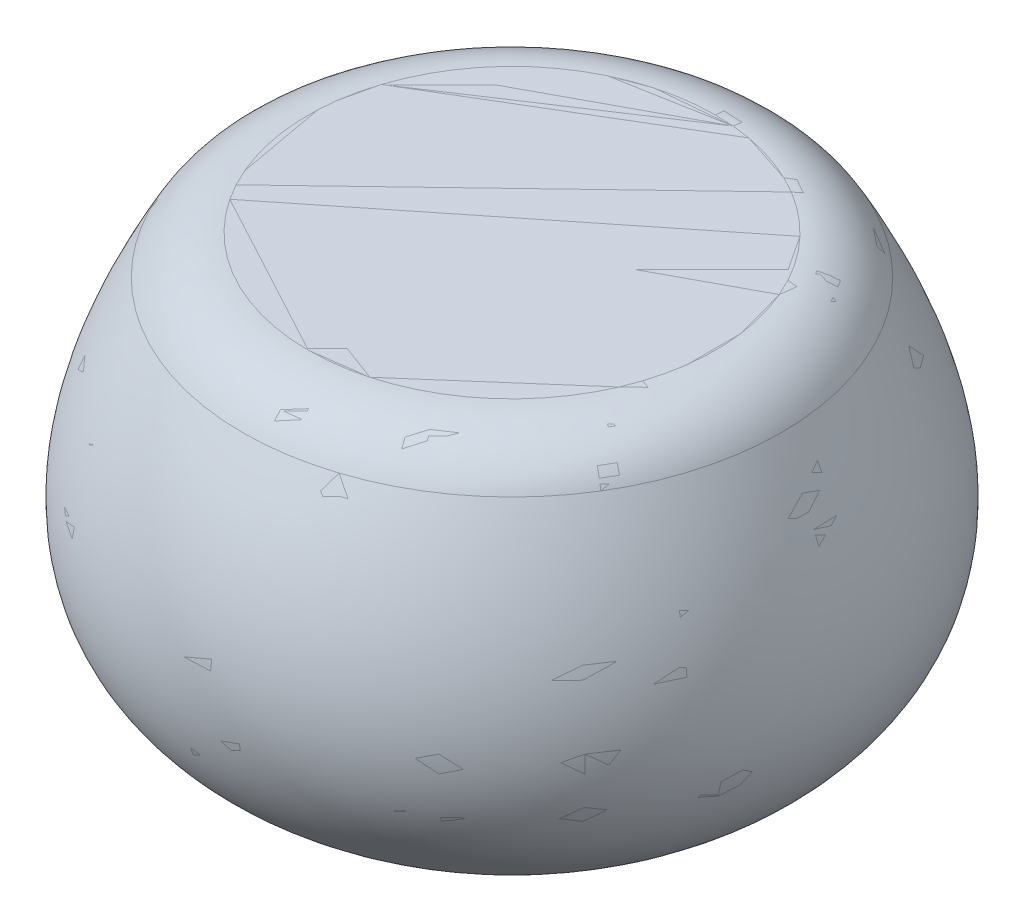
ISO-10303-21;
HEADER;
FILE_DESCRIPTION(('STEP AP214'),'2;1');
FILE_NAME('part.step','',(''),(''),'','','');
FILE_SCHEMA(('AUTOMOTIVE_DESIGN { 1 0 10303 214 1 1 1 1 }'));
ENDSEC;
DATA;
#1=APPLICATION_CONTEXT('core data for automotive mechanical design processes');
#2=APPLICATION_PROTOCOL_DEFINITION('international standard','automotive_design',2000,#1);
#3=PRODUCT_CONTEXT('',#1,'mechanical');
#4=PRODUCT('Part','Part','',(#3));
#5=PRODUCT_RELATED_PRODUCT_CATEGORY('part','',(#4));
#6=PRODUCT_DEFINITION_FORMATION('','',#4);
#7=PRODUCT_DEFINITION_CONTEXT('part definition',#1,'design');
#8=PRODUCT_DEFINITION('design','',#6,#7);
#9=PRODUCT_DEFINITION_SHAPE('','',#8);
#10=(LENGTH_UNIT() NAMED_UNIT(*) SI_UNIT(.MILLI.,.METRE.));
#11=(NAMED_UNIT(*) PLANE_ANGLE_UNIT() SI_UNIT($,.RADIAN.));
#12=(NAMED_UNIT(*) SI_UNIT($,.STERADIAN.) SOLID_ANGLE_UNIT());
#13=UNCERTAINTY_MEASURE_WITH_UNIT(LENGTH_MEASURE(1.E-05),#10,'distance_accuracy_value','');
#14=(GEOMETRIC_REPRESENTATION_CONTEXT(3) GLOBAL_UNCERTAINTY_ASSIGNED_CONTEXT((#13)) GLOBAL_UNIT_ASSIGNED_CONTEXT((#10,
#11,#12)) REPRESENTATION_CONTEXT('',''));
#15=CARTESIAN_POINT('',(0.,0.,0.));
#16=DIRECTION('',(0.,0.,1.));
#17=DIRECTION('',(1.,0.,0.));
#18=AXIS2_PLACEMENT_3D('',#15,#16,#17);
#19=CARTESIAN_POINT('',(-32.8601568198395,31.2442607099683,0.));
#20=CARTESIAN_POINT('',(-66.0245526526524,-21.9410159608166,0.));
#21=CARTESIAN_POINT('',(0.,-29.9764651818748,0.));
#22=B_SPLINE_CURVE_WITH_KNOTS('',2,(#19,#20,#21),.UNSPECIFIED.,.F.,.F.,(3,3),(0.,1.),.UNSPECIFIED.);
#23=CARTESIAN_POINT('',(0.,-36.5448515190839,0.));
#24=DIRECTION('',(0.,1.,0.));
#25=AXIS1_PLACEMENT('',#23,#24);
#26=SURFACE_OF_REVOLUTION('',#22,#25);
#27=CARTESIAN_POINT('',(0.,26.0944386957487,0.));
#28=DIRECTION('',(0.,1.,0.));
#29=DIRECTION('',(0.,0.,1.));
#30=AXIS2_PLACEMENT_3D('',#27,#28,#29);
#31=CIRCLE('',#30,35.897681248424);
#32=CARTESIAN_POINT('',(0.,26.0944386957487,35.897681248424));
#33=VERTEX_POINT('',#32);
#34=EDGE_CURVE('E56',#33,#33,#31,.F.);
#35=ORIENTED_EDGE('',*,*,#34,.T.);
#36=EDGE_LOOP('',(#35));
#37=FACE_BOUND('',#36,.T.);
#38=CARTESIAN_POINT('',(0.,-29.9764651818748,0.));
#39=VERTEX_POINT('',#38);
#40=VERTEX_LOOP('',#39);
#41=FACE_BOUND('',#40,.T.);
#42=ADVANCED_FACE('F49',(#37,#41),#26,.F.);
#43=CARTESIAN_POINT('',(0.,21.2442607099683,0.));
#44=DIRECTION('',(0.,1.,0.));
#45=DIRECTION('',(0.,0.,1.));
#46=AXIS2_PLACEMENT_3D('',#43,#44,#45);
#47=TOROIDAL_SURFACE('',#46,27.1526384522879,10.);
#48=ORIENTED_EDGE('',*,*,#34,.F.);
#49=EDGE_LOOP('',(#48));
#50=FACE_BOUND('',#49,.T.);
#51=CARTESIAN_POINT('',(0.,31.2442607099683,0.));
#52=DIRECTION('',(0.,1.,0.));
#53=DIRECTION('',(0.,0.,1.));
#54=AXIS2_PLACEMENT_3D('',#51,#52,#53);
#55=CIRCLE('',#54,27.1526384522879);
#56=CARTESIAN_POINT('',(0.,31.2442607099683,27.1526384522879));
#57=VERTEX_POINT('',#56);
#58=EDGE_CURVE('E12',#57,#57,#55,.T.);
#59=ORIENTED_EDGE('',*,*,#58,.F.);
#60=EDGE_LOOP('',(#59));
#61=FACE_BOUND('',#60,.T.);
#62=ADVANCED_FACE('F60',(#50,#61),#47,.T.);
#63=CARTESIAN_POINT('',(0.,31.2442607099683,0.));
#64=DIRECTION('',(0.,1.,0.));
#65=DIRECTION('',(0.,0.,1.));
#66=AXIS2_PLACEMENT_3D('',#63,#64,#65);
#67=PLANE('',#66);
#68=ORIENTED_EDGE('',*,*,#58,.T.);
#69=EDGE_LOOP('',(#68));
#70=FACE_BOUND('',#69,.T.);
#71=ADVANCED_FACE('F51',(#70),#67,.T.);
#72=CLOSED_SHELL('',(#42,#62,#71));
#73=MANIFOLD_SOLID_BREP('B2',#72);
#74=CARTESIAN_POINT('',(-32.8601568198395,31.2442607099683,0.));
#75=CARTESIAN_POINT('',(-66.0245526526524,-21.9410159608166,0.));
#76=CARTESIAN_POINT('',(0.,-29.9764651818748,0.));
#77=B_SPLINE_CURVE_WITH_KNOTS('',2,(#74,#75,#76),.UNSPECIFIED.,.F.,.F.,(3,3),(0.,1.),.UNSPECIFIED.);
#78=CARTESIAN_POINT('',(0.,-36.5448515190839,0.));
#79=DIRECTION('',(0.,1.,0.));
#80=AXIS1_PLACEMENT('',#78,#79);
#81=SURFACE_OF_REVOLUTION('',#77,#80);
#82=CARTESIAN_POINT('',(0.,26.0944386957487,0.));
#83=DIRECTION('',(0.,1.,0.));
#84=DIRECTION('',(0.,0.,1.));
#85=AXIS2_PLACEMENT_3D('',#82,#83,#84);
#86=CIRCLE('',#85,35.897681248424);
#87=CARTESIAN_POINT('',(0.,26.0944386957487,35.897681248424));
#88=VERTEX_POINT('',#87);
#89=EDGE_CURVE('E47',#88,#88,#86,.F.);
#90=ORIENTED_EDGE('',*,*,#89,.T.);
#91=EDGE_LOOP('',(#90));
#92=FACE_BOUND('',#91,.T.);
#93=CARTESIAN_POINT('',(0.,-29.9764651818748,0.));
#94=VERTEX_POINT('',#93);
#95=VERTEX_LOOP('',#94);
#96=FACE_BOUND('',#95,.T.);
#97=ADVANCED_FACE('F98',(#92,#96),#81,.F.);
#98=CARTESIAN_POINT('',(0.,31.2442607099683,0.));
#99=DIRECTION('',(0.,1.,0.));
#100=DIRECTION('',(0.,0.,1.));
#101=AXIS2_PLACEMENT_3D('',#98,#99,#100);
#102=PLANE('',#101);
#103=CARTESIAN_POINT('',(0.,31.2442607099683,0.));
#104=DIRECTION('',(0.,1.,0.));
#105=DIRECTION('',(0.,0.,1.));
#106=AXIS2_PLACEMENT_3D('',#103,#104,#105);
#107=CIRCLE('',#106,27.1526384522879);
#108=CARTESIAN_POINT('',(0.,31.2442607099683,27.1526384522879));
#109=VERTEX_POINT('',#108);
#110=EDGE_CURVE('E105',#109,#109,#107,.T.);
#111=ORIENTED_EDGE('',*,*,#110,.T.);
#112=EDGE_LOOP('',(#111));
#113=FACE_BOUND('',#112,.T.);
#114=ADVANCED_FACE('F109',(#113),#102,.T.);
#115=CARTESIAN_POINT('',(0.,21.2442607099683,0.));
#116=DIRECTION('',(0.,1.,0.));
#117=DIRECTION('',(0.,0.,1.));
#118=AXIS2_PLACEMENT_3D('',#115,#116,#117);
#119=TOROIDAL_SURFACE('',#118,27.1526384522879,10.);
#120=ORIENTED_EDGE('',*,*,#89,.F.);
#121=EDGE_LOOP('',(#120));
#122=FACE_BOUND('',#121,.T.);
#123=ORIENTED_EDGE('',*,*,#110,.F.);
#124=EDGE_LOOP('',(#123));
#125=FACE_BOUND('',#124,.T.);
#126=ADVANCED_FACE('F100',(#122,#125),#119,.T.);
#127=OPEN_SHELL('',(#97,#114,#126));
#128=SHELL_BASED_SURFACE_MODEL('B6',(#127));
#129=ADVANCED_BREP_SHAPE_REPRESENTATION('',(#18,#73),#14);
#130=MANIFOLD_SURFACE_SHAPE_REPRESENTATION('',(#18,#128),#14);
#131=SHAPE_REPRESENTATION('',(#18),#14);
#132=SHAPE_DEFINITION_REPRESENTATION(#9,#131);
#133=SHAPE_REPRESENTATION_RELATIONSHIP('','',#131,#129);
#134=SHAPE_REPRESENTATION_RELATIONSHIP('','',#131,#130);
ENDSEC;
END-ISO-10303-21;
